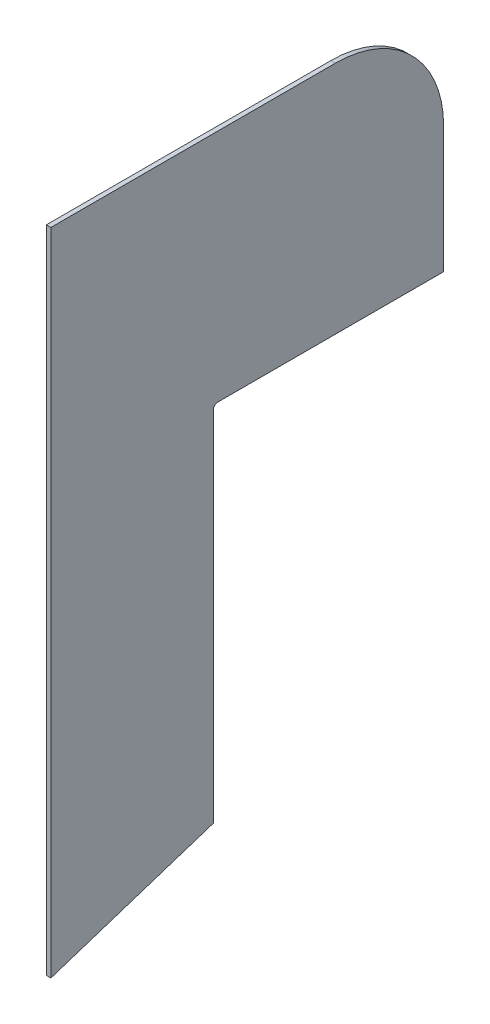
ISO-10303-21;
HEADER;
FILE_DESCRIPTION(('STEP AP214'),'2;1');
FILE_NAME('part.step','',(''),(''),'','','');
FILE_SCHEMA(('AUTOMOTIVE_DESIGN { 1 0 10303 214 1 1 1 1 }'));
ENDSEC;
DATA;
#1=APPLICATION_CONTEXT('core data for automotive mechanical design processes');
#2=APPLICATION_PROTOCOL_DEFINITION('international standard','automotive_design',2000,#1);
#3=PRODUCT_CONTEXT('',#1,'mechanical');
#4=PRODUCT('Part','Part','',(#3));
#5=PRODUCT_RELATED_PRODUCT_CATEGORY('part','',(#4));
#6=PRODUCT_DEFINITION_FORMATION('','',#4);
#7=PRODUCT_DEFINITION_CONTEXT('part definition',#1,'design');
#8=PRODUCT_DEFINITION('design','',#6,#7);
#9=PRODUCT_DEFINITION_SHAPE('','',#8);
#10=(LENGTH_UNIT() NAMED_UNIT(*) SI_UNIT(.MILLI.,.METRE.));
#11=(NAMED_UNIT(*) PLANE_ANGLE_UNIT() SI_UNIT($,.RADIAN.));
#12=(NAMED_UNIT(*) SI_UNIT($,.STERADIAN.) SOLID_ANGLE_UNIT());
#13=UNCERTAINTY_MEASURE_WITH_UNIT(LENGTH_MEASURE(1.E-05),#10,'distance_accuracy_value','');
#14=(GEOMETRIC_REPRESENTATION_CONTEXT(3) GLOBAL_UNCERTAINTY_ASSIGNED_CONTEXT((#13)) GLOBAL_UNIT_ASSIGNED_CONTEXT((#10,
#11,#12)) REPRESENTATION_CONTEXT('',''));
#15=CARTESIAN_POINT('',(0.,0.,0.));
#16=DIRECTION('',(0.,0.,1.));
#17=DIRECTION('',(1.,0.,0.));
#18=AXIS2_PLACEMENT_3D('',#15,#16,#17);
#19=CARTESIAN_POINT('',(0.,0.,0.));
#20=DIRECTION('',(1.,0.,0.));
#21=DIRECTION('',(0.,0.,-1.));
#22=AXIS2_PLACEMENT_3D('',#19,#20,#21);
#23=PLANE('',#22);
#24=DIRECTION('',(0.,0.309016994374891,-0.951056516295172));
#25=VECTOR('',#24,1.);
#26=CARTESIAN_POINT('',(0.,-749.3,276.225));
#27=LINE('',#26,#25);
#28=CARTESIAN_POINT('',(0.,-749.3,276.225));
#29=VERTEX_POINT('',#28);
#30=CARTESIAN_POINT('',(0.,-675.023357441094,47.624999999989));
#31=VERTEX_POINT('',#30);
#32=EDGE_CURVE('E122',#29,#31,#27,.T.);
#33=ORIENTED_EDGE('',*,*,#32,.F.);
#34=DIRECTION('',(0.,1.,0.));
#35=VECTOR('',#34,1.);
#36=CARTESIAN_POINT('',(0.,165.1,276.225));
#37=LINE('',#36,#35);
#38=CARTESIAN_POINT('',(0.,165.1,276.225));
#39=VERTEX_POINT('',#38);
#40=EDGE_CURVE('E128',#39,#29,#37,.F.);
#41=ORIENTED_EDGE('',*,*,#40,.F.);
#42=DIRECTION('',(0.,0.,1.));
#43=VECTOR('',#42,1.);
#44=CARTESIAN_POINT('',(0.,165.1,-276.225));
#45=LINE('',#44,#43);
#46=CARTESIAN_POINT('',(0.,165.1,-123.825));
#47=VERTEX_POINT('',#46);
#48=EDGE_CURVE('E134',#47,#39,#45,.T.);
#49=ORIENTED_EDGE('',*,*,#48,.F.);
#50=CARTESIAN_POINT('',(0.,12.7,-123.825));
#51=DIRECTION('',(-1.,0.,0.));
#52=DIRECTION('',(0.,0.,1.));
#53=AXIS2_PLACEMENT_3D('',#50,#51,#52);
#54=CIRCLE('',#53,152.4);
#55=CARTESIAN_POINT('',(0.,12.7,-276.225));
#56=VERTEX_POINT('',#55);
#57=EDGE_CURVE('E36',#56,#47,#54,.F.);
#58=ORIENTED_EDGE('',*,*,#57,.F.);
#59=DIRECTION('',(0.,1.,0.));
#60=VECTOR('',#59,1.);
#61=CARTESIAN_POINT('',(0.,-165.1,-276.225));
#62=LINE('',#61,#60);
#63=CARTESIAN_POINT('',(0.,-165.1,-276.225));
#64=VERTEX_POINT('',#63);
#65=EDGE_CURVE('E98',#64,#56,#62,.T.);
#66=ORIENTED_EDGE('',*,*,#65,.F.);
#67=DIRECTION('',(0.,0.,-1.));
#68=VECTOR('',#67,1.);
#69=CARTESIAN_POINT('',(0.,-165.1,276.225));
#70=LINE('',#69,#68);
#71=CARTESIAN_POINT('',(0.,-165.1,41.275));
#72=VERTEX_POINT('',#71);
#73=EDGE_CURVE('E89',#72,#64,#70,.T.);
#74=ORIENTED_EDGE('',*,*,#73,.F.);
#75=CARTESIAN_POINT('',(0.,-171.45,41.275));
#76=DIRECTION('',(1.,0.,0.));
#77=DIRECTION('',(0.,0.,-1.));
#78=AXIS2_PLACEMENT_3D('',#75,#76,#77);
#79=CIRCLE('',#78,6.35);
#80=CARTESIAN_POINT('',(0.,-171.45,47.625));
#81=VERTEX_POINT('',#80);
#82=EDGE_CURVE('E118',#72,#81,#79,.T.);
#83=ORIENTED_EDGE('',*,*,#82,.T.);
#84=DIRECTION('',(0.,1.,0.));
#85=VECTOR('',#84,1.);
#86=CARTESIAN_POINT('',(0.,-675.02335744106,47.625));
#87=LINE('',#86,#85);
#88=EDGE_CURVE('E116',#31,#81,#87,.T.);
#89=ORIENTED_EDGE('',*,*,#88,.F.);
#90=EDGE_LOOP('',(#33,#41,#49,#58,#66,#74,#83,#89));
#91=FACE_BOUND('',#90,.T.);
#92=ADVANCED_FACE('F33',(#91),#23,.F.);
#93=CARTESIAN_POINT('',(0.,-165.1,276.225));
#94=DIRECTION('',(0.,-1.,0.));
#95=DIRECTION('',(0.,0.,-1.));
#96=AXIS2_PLACEMENT_3D('',#93,#94,#95);
#97=PLANE('',#96);
#98=DIRECTION('',(-1.,0.,0.));
#99=VECTOR('',#98,1.);
#100=CARTESIAN_POINT('',(0.,-165.1,-276.225));
#101=LINE('',#100,#99);
#102=CARTESIAN_POINT('',(6.35,-165.1,-276.225));
#103=VERTEX_POINT('',#102);
#104=EDGE_CURVE('E92',#103,#64,#101,.T.);
#105=ORIENTED_EDGE('',*,*,#104,.F.);
#106=DIRECTION('',(0.,0.,-1.));
#107=VECTOR('',#106,1.);
#108=CARTESIAN_POINT('',(6.35,-165.1,0.));
#109=LINE('',#108,#107);
#110=CARTESIAN_POINT('',(6.35,-165.1,41.275));
#111=VERTEX_POINT('',#110);
#112=EDGE_CURVE('E147',#111,#103,#109,.T.);
#113=ORIENTED_EDGE('',*,*,#112,.F.);
#114=DIRECTION('',(1.,0.,0.));
#115=VECTOR('',#114,1.);
#116=CARTESIAN_POINT('',(-8.27786,-165.1,41.275));
#117=LINE('',#116,#115);
#118=EDGE_CURVE('E95',#111,#72,#117,.F.);
#119=ORIENTED_EDGE('',*,*,#118,.T.);
#120=ORIENTED_EDGE('',*,*,#73,.T.);
#121=EDGE_LOOP('',(#105,#113,#119,#120));
#122=FACE_BOUND('',#121,.T.);
#123=ADVANCED_FACE('F90',(#122),#97,.T.);
#124=CARTESIAN_POINT('',(0.,-165.1,-276.225));
#125=DIRECTION('',(0.,0.,-1.));
#126=DIRECTION('',(-1.,0.,0.));
#127=AXIS2_PLACEMENT_3D('',#124,#125,#126);
#128=PLANE('',#127);
#129=ORIENTED_EDGE('',*,*,#104,.T.);
#130=ORIENTED_EDGE('',*,*,#65,.T.);
#131=DIRECTION('',(-1.,0.,0.));
#132=VECTOR('',#131,1.);
#133=CARTESIAN_POINT('',(190.23838,12.7,-276.225));
#134=LINE('',#133,#132);
#135=CARTESIAN_POINT('',(6.35,12.7,-276.225));
#136=VERTEX_POINT('',#135);
#137=EDGE_CURVE('E110',#136,#56,#134,.T.);
#138=ORIENTED_EDGE('',*,*,#137,.F.);
#139=DIRECTION('',(0.,1.,0.));
#140=VECTOR('',#139,1.);
#141=CARTESIAN_POINT('',(6.35,0.,-276.225));
#142=LINE('',#141,#140);
#143=EDGE_CURVE('E105',#103,#136,#142,.T.);
#144=ORIENTED_EDGE('',*,*,#143,.F.);
#145=EDGE_LOOP('',(#129,#130,#138,#144));
#146=FACE_BOUND('',#145,.T.);
#147=ADVANCED_FACE('F103',(#146),#128,.T.);
#148=CARTESIAN_POINT('',(190.23838,12.7,-123.825));
#149=DIRECTION('',(-1.,0.,0.));
#150=DIRECTION('',(0.,0.,1.));
#151=AXIS2_PLACEMENT_3D('',#148,#149,#150);
#152=CYLINDRICAL_SURFACE('',#151,152.4);
#153=CARTESIAN_POINT('',(6.34999999999999,12.7,-123.825));
#154=DIRECTION('',(-1.,0.,0.));
#155=DIRECTION('',(0.,0.,1.));
#156=AXIS2_PLACEMENT_3D('',#153,#154,#155);
#157=CIRCLE('',#156,152.4);
#158=CARTESIAN_POINT('',(6.35,165.1,-123.825));
#159=VERTEX_POINT('',#158);
#160=EDGE_CURVE('E142',#136,#159,#157,.F.);
#161=ORIENTED_EDGE('',*,*,#160,.F.);
#162=ORIENTED_EDGE('',*,*,#137,.T.);
#163=ORIENTED_EDGE('',*,*,#57,.T.);
#164=DIRECTION('',(1.,0.,0.));
#165=VECTOR('',#164,1.);
#166=CARTESIAN_POINT('',(0.,165.1,-123.825));
#167=LINE('',#166,#165);
#168=EDGE_CURVE('E137',#159,#47,#167,.F.);
#169=ORIENTED_EDGE('',*,*,#168,.F.);
#170=EDGE_LOOP('',(#161,#162,#163,#169));
#171=FACE_BOUND('',#170,.T.);
#172=ADVANCED_FACE('F179',(#171),#152,.T.);
#173=CARTESIAN_POINT('',(0.,165.1,-276.225));
#174=DIRECTION('',(0.,1.,0.));
#175=DIRECTION('',(0.,0.,1.));
#176=AXIS2_PLACEMENT_3D('',#173,#174,#175);
#177=PLANE('',#176);
#178=DIRECTION('',(1.,0.,0.));
#179=VECTOR('',#178,1.);
#180=CARTESIAN_POINT('',(0.,165.1,276.225));
#181=LINE('',#180,#179);
#182=CARTESIAN_POINT('',(6.35,165.1,276.225));
#183=VERTEX_POINT('',#182);
#184=EDGE_CURVE('E131',#183,#39,#181,.F.);
#185=ORIENTED_EDGE('',*,*,#184,.F.);
#186=DIRECTION('',(0.,0.,-1.));
#187=VECTOR('',#186,1.);
#188=CARTESIAN_POINT('',(6.35,165.1,0.));
#189=LINE('',#188,#187);
#190=EDGE_CURVE('E144',#159,#183,#189,.F.);
#191=ORIENTED_EDGE('',*,*,#190,.F.);
#192=ORIENTED_EDGE('',*,*,#168,.T.);
#193=ORIENTED_EDGE('',*,*,#48,.T.);
#194=EDGE_LOOP('',(#185,#191,#192,#193));
#195=FACE_BOUND('',#194,.T.);
#196=ADVANCED_FACE('F182',(#195),#177,.T.);
#197=CARTESIAN_POINT('',(0.,165.1,276.225));
#198=DIRECTION('',(0.,0.,1.));
#199=DIRECTION('',(1.,0.,0.));
#200=AXIS2_PLACEMENT_3D('',#197,#198,#199);
#201=PLANE('',#200);
#202=ORIENTED_EDGE('',*,*,#40,.T.);
#203=DIRECTION('',(1.,0.,0.));
#204=VECTOR('',#203,1.);
#205=CARTESIAN_POINT('',(6.35,-749.3,276.225));
#206=LINE('',#205,#204);
#207=CARTESIAN_POINT('',(6.35,-749.3,276.225));
#208=VERTEX_POINT('',#207);
#209=EDGE_CURVE('E125',#208,#29,#206,.F.);
#210=ORIENTED_EDGE('',*,*,#209,.F.);
#211=DIRECTION('',(0.,1.,0.));
#212=VECTOR('',#211,1.);
#213=CARTESIAN_POINT('',(6.35,0.,276.225));
#214=LINE('',#213,#212);
#215=EDGE_CURVE('E160',#183,#208,#214,.F.);
#216=ORIENTED_EDGE('',*,*,#215,.F.);
#217=ORIENTED_EDGE('',*,*,#184,.T.);
#218=EDGE_LOOP('',(#202,#210,#216,#217));
#219=FACE_BOUND('',#218,.T.);
#220=ADVANCED_FACE('F201',(#219),#201,.T.);
#221=CARTESIAN_POINT('',(6.35,-749.3,276.225));
#222=DIRECTION('',(0.,-0.951056516295172,-0.309016994374891));
#223=DIRECTION('',(0.,0.309016994374891,-0.951056516295172));
#224=AXIS2_PLACEMENT_3D('',#221,#222,#223);
#225=PLANE('',#224);
#226=ORIENTED_EDGE('',*,*,#32,.T.);
#227=DIRECTION('',(-1.,0.,0.));
#228=VECTOR('',#227,1.);
#229=CARTESIAN_POINT('',(6.35,-675.02335744106,47.625));
#230=LINE('',#229,#228);
#231=CARTESIAN_POINT('',(6.35,-675.02335744106,47.625));
#232=VERTEX_POINT('',#231);
#233=EDGE_CURVE('E119',#232,#31,#230,.T.);
#234=ORIENTED_EDGE('',*,*,#233,.F.);
#235=DIRECTION('',(0.,0.309016994375315,-0.951056516295034));
#236=VECTOR('',#235,1.);
#237=CARTESIAN_POINT('',(6.35,-749.3,276.225));
#238=LINE('',#237,#236);
#239=EDGE_CURVE('E157',#208,#232,#238,.T.);
#240=ORIENTED_EDGE('',*,*,#239,.F.);
#241=ORIENTED_EDGE('',*,*,#209,.T.);
#242=EDGE_LOOP('',(#226,#234,#240,#241));
#243=FACE_BOUND('',#242,.T.);
#244=ADVANCED_FACE('F192',(#243),#225,.T.);
#245=CARTESIAN_POINT('',(6.35,-675.02335744106,47.625));
#246=DIRECTION('',(0.,0.,-1.));
#247=DIRECTION('',(-1.,0.,0.));
#248=AXIS2_PLACEMENT_3D('',#245,#246,#247);
#249=PLANE('',#248);
#250=ORIENTED_EDGE('',*,*,#233,.T.);
#251=ORIENTED_EDGE('',*,*,#88,.T.);
#252=DIRECTION('',(1.,0.,0.));
#253=VECTOR('',#252,1.);
#254=CARTESIAN_POINT('',(-8.27786,-171.45,47.625));
#255=LINE('',#254,#253);
#256=CARTESIAN_POINT('',(6.35,-171.45,47.625));
#257=VERTEX_POINT('',#256);
#258=EDGE_CURVE('E51',#81,#257,#255,.T.);
#259=ORIENTED_EDGE('',*,*,#258,.T.);
#260=DIRECTION('',(0.,1.,0.));
#261=VECTOR('',#260,1.);
#262=CARTESIAN_POINT('',(6.35,0.,47.625));
#263=LINE('',#262,#261);
#264=EDGE_CURVE('E42',#232,#257,#263,.T.);
#265=ORIENTED_EDGE('',*,*,#264,.F.);
#266=EDGE_LOOP('',(#250,#251,#259,#265));
#267=FACE_BOUND('',#266,.T.);
#268=ADVANCED_FACE('F194',(#267),#249,.T.);
#269=CARTESIAN_POINT('',(-8.27786,-171.45,41.275));
#270=DIRECTION('',(1.,0.,0.));
#271=DIRECTION('',(0.,0.,-1.));
#272=AXIS2_PLACEMENT_3D('',#269,#270,#271);
#273=CYLINDRICAL_SURFACE('',#272,6.35);
#274=CARTESIAN_POINT('',(6.35,-171.45,41.275));
#275=DIRECTION('',(1.,0.,0.));
#276=DIRECTION('',(0.,0.,-1.));
#277=AXIS2_PLACEMENT_3D('',#274,#275,#276);
#278=CIRCLE('',#277,6.35);
#279=EDGE_CURVE('E11',#257,#111,#278,.F.);
#280=ORIENTED_EDGE('',*,*,#279,.F.);
#281=ORIENTED_EDGE('',*,*,#258,.F.);
#282=ORIENTED_EDGE('',*,*,#82,.F.);
#283=ORIENTED_EDGE('',*,*,#118,.F.);
#284=EDGE_LOOP('',(#280,#281,#282,#283));
#285=FACE_BOUND('',#284,.T.);
#286=ADVANCED_FACE('F212',(#285),#273,.F.);
#287=CARTESIAN_POINT('',(6.35,0.,0.));
#288=DIRECTION('',(1.,0.,0.));
#289=DIRECTION('',(0.,0.,-1.));
#290=AXIS2_PLACEMENT_3D('',#287,#288,#289);
#291=PLANE('',#290);
#292=ORIENTED_EDGE('',*,*,#264,.T.);
#293=ORIENTED_EDGE('',*,*,#279,.T.);
#294=ORIENTED_EDGE('',*,*,#112,.T.);
#295=ORIENTED_EDGE('',*,*,#143,.T.);
#296=ORIENTED_EDGE('',*,*,#160,.T.);
#297=ORIENTED_EDGE('',*,*,#190,.T.);
#298=ORIENTED_EDGE('',*,*,#215,.T.);
#299=ORIENTED_EDGE('',*,*,#239,.T.);
#300=EDGE_LOOP('',(#292,#293,#294,#295,#296,#297,#298,#299));
#301=FACE_BOUND('',#300,.T.);
#302=ADVANCED_FACE('F198',(#301),#291,.T.);
#303=CLOSED_SHELL('',(#92,#123,#147,#172,#196,#220,#244,#268,#286,#302));
#304=MANIFOLD_SOLID_BREP('B2',#303);
#305=ADVANCED_BREP_SHAPE_REPRESENTATION('',(#18,#304),#14);
#306=SHAPE_DEFINITION_REPRESENTATION(#9,#305);
ENDSEC;
END-ISO-10303-21;
